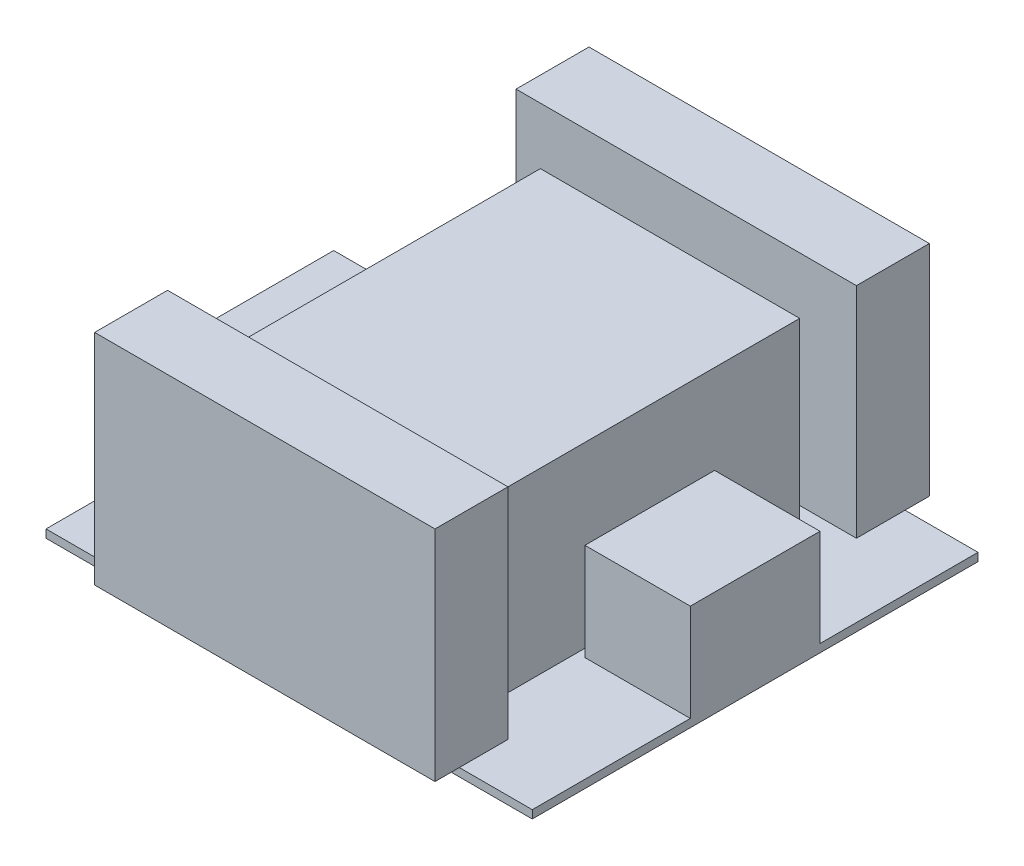
ISO-10303-21;
HEADER;
FILE_DESCRIPTION(('STEP AP214'),'2;1');
FILE_NAME('part.step','',(''),(''),'','','');
FILE_SCHEMA(('AUTOMOTIVE_DESIGN { 1 0 10303 214 1 1 1 1 }'));
ENDSEC;
DATA;
#1=APPLICATION_CONTEXT('core data for automotive mechanical design processes');
#2=APPLICATION_PROTOCOL_DEFINITION('international standard','automotive_design',2000,#1);
#3=PRODUCT_CONTEXT('',#1,'mechanical');
#4=PRODUCT('Part','Part','',(#3));
#5=PRODUCT_RELATED_PRODUCT_CATEGORY('part','',(#4));
#6=PRODUCT_DEFINITION_FORMATION('','',#4);
#7=PRODUCT_DEFINITION_CONTEXT('part definition',#1,'design');
#8=PRODUCT_DEFINITION('design','',#6,#7);
#9=PRODUCT_DEFINITION_SHAPE('','',#8);
#10=(LENGTH_UNIT() NAMED_UNIT(*) SI_UNIT(.MILLI.,.METRE.));
#11=(NAMED_UNIT(*) PLANE_ANGLE_UNIT() SI_UNIT($,.RADIAN.));
#12=(NAMED_UNIT(*) SI_UNIT($,.STERADIAN.) SOLID_ANGLE_UNIT());
#13=UNCERTAINTY_MEASURE_WITH_UNIT(LENGTH_MEASURE(1.E-05),#10,'distance_accuracy_value','');
#14=(GEOMETRIC_REPRESENTATION_CONTEXT(3) GLOBAL_UNCERTAINTY_ASSIGNED_CONTEXT((#13)) GLOBAL_UNIT_ASSIGNED_CONTEXT((#10,
#11,#12)) REPRESENTATION_CONTEXT('',''));
#15=CARTESIAN_POINT('',(0.,0.,0.));
#16=DIRECTION('',(0.,0.,1.));
#17=DIRECTION('',(1.,0.,0.));
#18=AXIS2_PLACEMENT_3D('',#15,#16,#17);
#19=CARTESIAN_POINT('',(0.,1.,0.));
#20=DIRECTION('',(0.,-1.,0.));
#21=DIRECTION('',(0.,0.,-1.));
#22=AXIS2_PLACEMENT_3D('',#19,#20,#21);
#23=PLANE('',#22);
#24=DIRECTION('',(-1.,0.,0.));
#25=VECTOR('',#24,1.);
#26=CARTESIAN_POINT('',(30.,1.,-8.));
#27=LINE('',#26,#25);
#28=CARTESIAN_POINT('',(30.,1.,-8.));
#29=VERTEX_POINT('',#28);
#30=CARTESIAN_POINT('',(17.,1.,-8.));
#31=VERTEX_POINT('',#30);
#32=EDGE_CURVE('E273',#29,#31,#27,.T.);
#33=ORIENTED_EDGE('',*,*,#32,.F.);
#34=DIRECTION('',(0.,0.,-1.));
#35=VECTOR('',#34,1.);
#36=CARTESIAN_POINT('',(30.,1.,27.5));
#37=LINE('',#36,#35);
#38=CARTESIAN_POINT('',(30.,1.,-27.5));
#39=VERTEX_POINT('',#38);
#40=EDGE_CURVE('E382',#29,#39,#37,.T.);
#41=ORIENTED_EDGE('',*,*,#40,.T.);
#42=DIRECTION('',(-1.,0.,0.));
#43=VECTOR('',#42,1.);
#44=CARTESIAN_POINT('',(-30.,1.,-27.5));
#45=LINE('',#44,#43);
#46=CARTESIAN_POINT('',(21.,1.,-27.5));
#47=VERTEX_POINT('',#46);
#48=EDGE_CURVE('E383',#39,#47,#45,.T.);
#49=ORIENTED_EDGE('',*,*,#48,.T.);
#50=DIRECTION('',(0.,0.,-1.));
#51=VECTOR('',#50,1.);
#52=CARTESIAN_POINT('',(21.,1.,-30.5));
#53=LINE('',#52,#51);
#54=CARTESIAN_POINT('',(21.,1.,-21.5));
#55=VERTEX_POINT('',#54);
#56=EDGE_CURVE('E363',#55,#47,#53,.T.);
#57=ORIENTED_EDGE('',*,*,#56,.F.);
#58=DIRECTION('',(1.,0.,0.));
#59=VECTOR('',#58,1.);
#60=CARTESIAN_POINT('',(-21.,1.,-21.5));
#61=LINE('',#60,#59);
#62=CARTESIAN_POINT('',(-21.,1.,-21.5));
#63=VERTEX_POINT('',#62);
#64=EDGE_CURVE('E359',#63,#55,#61,.T.);
#65=ORIENTED_EDGE('',*,*,#64,.F.);
#66=DIRECTION('',(0.,0.,1.));
#67=VECTOR('',#66,1.);
#68=CARTESIAN_POINT('',(-21.,1.,-30.5));
#69=LINE('',#68,#67);
#70=CARTESIAN_POINT('',(-21.,1.,-27.5));
#71=VERTEX_POINT('',#70);
#72=EDGE_CURVE('E12',#71,#63,#69,.T.);
#73=ORIENTED_EDGE('',*,*,#72,.F.);
#74=CARTESIAN_POINT('',(-30.,1.,-27.5));
#75=VERTEX_POINT('',#74);
#76=EDGE_CURVE('E381',#71,#75,#45,.T.);
#77=ORIENTED_EDGE('',*,*,#76,.T.);
#78=DIRECTION('',(0.,0.,1.));
#79=VECTOR('',#78,1.);
#80=CARTESIAN_POINT('',(-30.,1.,27.5));
#81=LINE('',#80,#79);
#82=CARTESIAN_POINT('',(-30.,1.,-8.));
#83=VERTEX_POINT('',#82);
#84=EDGE_CURVE('E388',#75,#83,#81,.T.);
#85=ORIENTED_EDGE('',*,*,#84,.T.);
#86=DIRECTION('',(-1.,0.,0.));
#87=VECTOR('',#86,1.);
#88=CARTESIAN_POINT('',(-30.,1.,-8.));
#89=LINE('',#88,#87);
#90=CARTESIAN_POINT('',(-17.,1.,-8.));
#91=VERTEX_POINT('',#90);
#92=EDGE_CURVE('E288',#91,#83,#89,.T.);
#93=ORIENTED_EDGE('',*,*,#92,.F.);
#94=DIRECTION('',(0.,0.,-1.));
#95=VECTOR('',#94,1.);
#96=CARTESIAN_POINT('',(-17.,1.,-8.));
#97=LINE('',#96,#95);
#98=CARTESIAN_POINT('',(-17.,1.,8.));
#99=VERTEX_POINT('',#98);
#100=EDGE_CURVE('E297',#99,#91,#97,.T.);
#101=ORIENTED_EDGE('',*,*,#100,.F.);
#102=DIRECTION('',(1.,0.,0.));
#103=VECTOR('',#102,1.);
#104=CARTESIAN_POINT('',(-30.,1.,8.));
#105=LINE('',#104,#103);
#106=CARTESIAN_POINT('',(-30.,1.,8.));
#107=VERTEX_POINT('',#106);
#108=EDGE_CURVE('E276',#107,#99,#105,.T.);
#109=ORIENTED_EDGE('',*,*,#108,.F.);
#110=CARTESIAN_POINT('',(-30.,1.,27.5));
#111=VERTEX_POINT('',#110);
#112=EDGE_CURVE('E386',#107,#111,#81,.T.);
#113=ORIENTED_EDGE('',*,*,#112,.T.);
#114=DIRECTION('',(1.,0.,0.));
#115=VECTOR('',#114,1.);
#116=CARTESIAN_POINT('',(-30.,1.,27.5));
#117=LINE('',#116,#115);
#118=CARTESIAN_POINT('',(-21.,1.,27.5));
#119=VERTEX_POINT('',#118);
#120=EDGE_CURVE('E391',#111,#119,#117,.T.);
#121=ORIENTED_EDGE('',*,*,#120,.T.);
#122=DIRECTION('',(0.,0.,1.));
#123=VECTOR('',#122,1.);
#124=CARTESIAN_POINT('',(-21.,1.,30.5));
#125=LINE('',#124,#123);
#126=CARTESIAN_POINT('',(-21.,1.,21.5));
#127=VERTEX_POINT('',#126);
#128=EDGE_CURVE('E337',#127,#119,#125,.T.);
#129=ORIENTED_EDGE('',*,*,#128,.F.);
#130=DIRECTION('',(-1.,0.,0.));
#131=VECTOR('',#130,1.);
#132=CARTESIAN_POINT('',(-21.,1.,21.5));
#133=LINE('',#132,#131);
#134=CARTESIAN_POINT('',(21.,1.,21.5));
#135=VERTEX_POINT('',#134);
#136=EDGE_CURVE('E326',#135,#127,#133,.T.);
#137=ORIENTED_EDGE('',*,*,#136,.F.);
#138=DIRECTION('',(0.,0.,-1.));
#139=VECTOR('',#138,1.);
#140=CARTESIAN_POINT('',(21.,1.,30.5));
#141=LINE('',#140,#139);
#142=CARTESIAN_POINT('',(21.,1.,27.5));
#143=VERTEX_POINT('',#142);
#144=EDGE_CURVE('E329',#143,#135,#141,.T.);
#145=ORIENTED_EDGE('',*,*,#144,.F.);
#146=CARTESIAN_POINT('',(30.,1.,27.5));
#147=VERTEX_POINT('',#146);
#148=EDGE_CURVE('E390',#143,#147,#117,.T.);
#149=ORIENTED_EDGE('',*,*,#148,.T.);
#150=CARTESIAN_POINT('',(30.,1.,8.));
#151=VERTEX_POINT('',#150);
#152=EDGE_CURVE('E379',#147,#151,#37,.T.);
#153=ORIENTED_EDGE('',*,*,#152,.T.);
#154=DIRECTION('',(1.,0.,0.));
#155=VECTOR('',#154,1.);
#156=CARTESIAN_POINT('',(30.,1.,8.));
#157=LINE('',#156,#155);
#158=CARTESIAN_POINT('',(17.,1.,8.));
#159=VERTEX_POINT('',#158);
#160=EDGE_CURVE('E266',#159,#151,#157,.T.);
#161=ORIENTED_EDGE('',*,*,#160,.F.);
#162=DIRECTION('',(0.,0.,1.));
#163=VECTOR('',#162,1.);
#164=CARTESIAN_POINT('',(17.,1.,-8.));
#165=LINE('',#164,#163);
#166=EDGE_CURVE('E269',#31,#159,#165,.T.);
#167=ORIENTED_EDGE('',*,*,#166,.F.);
#168=EDGE_LOOP('',(#33,#41,#49,#57,#65,#73,#77,#85,#93,#101,#109,#113,#121,#129,#137,#145,#149,
#153,#161,#167));
#169=FACE_BOUND('',#168,.T.);
#170=DIRECTION('',(0.,0.,-1.));
#171=VECTOR('',#170,1.);
#172=CARTESIAN_POINT('',(16.,1.,19.5));
#173=LINE('',#172,#171);
#174=CARTESIAN_POINT('',(16.,1.,19.5));
#175=VERTEX_POINT('',#174);
#176=CARTESIAN_POINT('',(16.,1.,-19.5));
#177=VERTEX_POINT('',#176);
#178=EDGE_CURVE('E248',#175,#177,#173,.T.);
#179=ORIENTED_EDGE('',*,*,#178,.F.);
#180=DIRECTION('',(1.,0.,0.));
#181=VECTOR('',#180,1.);
#182=CARTESIAN_POINT('',(-16.,1.,19.5));
#183=LINE('',#182,#181);
#184=CARTESIAN_POINT('',(-16.,1.,19.5));
#185=VERTEX_POINT('',#184);
#186=EDGE_CURVE('E226',#185,#175,#183,.T.);
#187=ORIENTED_EDGE('',*,*,#186,.F.);
#188=DIRECTION('',(0.,0.,1.));
#189=VECTOR('',#188,1.);
#190=CARTESIAN_POINT('',(-16.,1.,19.5));
#191=LINE('',#190,#189);
#192=CARTESIAN_POINT('',(-16.,1.,-19.5));
#193=VERTEX_POINT('',#192);
#194=EDGE_CURVE('E67',#193,#185,#191,.T.);
#195=ORIENTED_EDGE('',*,*,#194,.F.);
#196=DIRECTION('',(-1.,0.,0.));
#197=VECTOR('',#196,1.);
#198=CARTESIAN_POINT('',(-16.,1.,-19.5));
#199=LINE('',#198,#197);
#200=EDGE_CURVE('E62',#177,#193,#199,.T.);
#201=ORIENTED_EDGE('',*,*,#200,.F.);
#202=EDGE_LOOP('',(#179,#187,#195,#201));
#203=FACE_BOUND('',#202,.T.);
#204=ADVANCED_FACE('F45',(#169,#203),#23,.F.);
#205=CARTESIAN_POINT('',(30.,1.,27.5));
#206=DIRECTION('',(-1.,0.,0.));
#207=DIRECTION('',(0.,0.,1.));
#208=AXIS2_PLACEMENT_3D('',#205,#206,#207);
#209=PLANE('',#208);
#210=DIRECTION('',(0.,0.,-1.));
#211=VECTOR('',#210,1.);
#212=CARTESIAN_POINT('',(30.,0.,27.5));
#213=LINE('',#212,#211);
#214=CARTESIAN_POINT('',(30.,0.,27.5));
#215=VERTEX_POINT('',#214);
#216=CARTESIAN_POINT('',(30.,0.,-27.5));
#217=VERTEX_POINT('',#216);
#218=EDGE_CURVE('E378',#215,#217,#213,.T.);
#219=ORIENTED_EDGE('',*,*,#218,.T.);
#220=DIRECTION('',(0.,-1.,0.));
#221=VECTOR('',#220,1.);
#222=CARTESIAN_POINT('',(30.,1.,-27.5));
#223=LINE('',#222,#221);
#224=EDGE_CURVE('E49',#39,#217,#223,.T.);
#225=ORIENTED_EDGE('',*,*,#224,.F.);
#226=ORIENTED_EDGE('',*,*,#40,.F.);
#227=DIRECTION('',(0.,-1.,0.));
#228=VECTOR('',#227,1.);
#229=CARTESIAN_POINT('',(30.,13.,-8.));
#230=LINE('',#229,#228);
#231=CARTESIAN_POINT('',(30.,13.,-8.));
#232=VERTEX_POINT('',#231);
#233=EDGE_CURVE('E241',#232,#29,#230,.T.);
#234=ORIENTED_EDGE('',*,*,#233,.F.);
#235=DIRECTION('',(0.,0.,-1.));
#236=VECTOR('',#235,1.);
#237=CARTESIAN_POINT('',(30.,13.,-8.));
#238=LINE('',#237,#236);
#239=CARTESIAN_POINT('',(30.,13.,8.));
#240=VERTEX_POINT('',#239);
#241=EDGE_CURVE('E270',#240,#232,#238,.T.);
#242=ORIENTED_EDGE('',*,*,#241,.F.);
#243=DIRECTION('',(0.,-1.,0.));
#244=VECTOR('',#243,1.);
#245=CARTESIAN_POINT('',(30.,13.,8.));
#246=LINE('',#245,#244);
#247=EDGE_CURVE('E262',#240,#151,#246,.T.);
#248=ORIENTED_EDGE('',*,*,#247,.T.);
#249=ORIENTED_EDGE('',*,*,#152,.F.);
#250=DIRECTION('',(0.,-1.,0.));
#251=VECTOR('',#250,1.);
#252=CARTESIAN_POINT('',(30.,1.,27.5));
#253=LINE('',#252,#251);
#254=EDGE_CURVE('E394',#147,#215,#253,.T.);
#255=ORIENTED_EDGE('',*,*,#254,.T.);
#256=EDGE_LOOP('',(#219,#225,#226,#234,#242,#248,#249,#255));
#257=FACE_BOUND('',#256,.T.);
#258=ADVANCED_FACE('F47',(#257),#209,.F.);
#259=CARTESIAN_POINT('',(-30.,1.,-27.5));
#260=DIRECTION('',(0.,0.,1.));
#261=DIRECTION('',(1.,0.,0.));
#262=AXIS2_PLACEMENT_3D('',#259,#260,#261);
#263=PLANE('',#262);
#264=DIRECTION('',(-1.,0.,0.));
#265=VECTOR('',#264,1.);
#266=CARTESIAN_POINT('',(-30.,0.,-27.5));
#267=LINE('',#266,#265);
#268=CARTESIAN_POINT('',(-30.,0.,-27.5));
#269=VERTEX_POINT('',#268);
#270=EDGE_CURVE('E398',#217,#269,#267,.T.);
#271=ORIENTED_EDGE('',*,*,#270,.T.);
#272=DIRECTION('',(0.,-1.,0.));
#273=VECTOR('',#272,1.);
#274=CARTESIAN_POINT('',(-30.,1.,-27.5));
#275=LINE('',#274,#273);
#276=EDGE_CURVE('E408',#75,#269,#275,.T.);
#277=ORIENTED_EDGE('',*,*,#276,.F.);
#278=ORIENTED_EDGE('',*,*,#76,.F.);
#279=EDGE_CURVE('E387',#47,#71,#45,.T.);
#280=ORIENTED_EDGE('',*,*,#279,.F.);
#281=ORIENTED_EDGE('',*,*,#48,.F.);
#282=ORIENTED_EDGE('',*,*,#224,.T.);
#283=EDGE_LOOP('',(#271,#277,#278,#280,#281,#282));
#284=FACE_BOUND('',#283,.T.);
#285=ADVANCED_FACE('F418',(#284),#263,.F.);
#286=CARTESIAN_POINT('',(-30.,1.,27.5));
#287=DIRECTION('',(1.,0.,0.));
#288=DIRECTION('',(0.,0.,-1.));
#289=AXIS2_PLACEMENT_3D('',#286,#287,#288);
#290=PLANE('',#289);
#291=DIRECTION('',(0.,0.,1.));
#292=VECTOR('',#291,1.);
#293=CARTESIAN_POINT('',(-30.,0.,27.5));
#294=LINE('',#293,#292);
#295=CARTESIAN_POINT('',(-30.,0.,27.5));
#296=VERTEX_POINT('',#295);
#297=EDGE_CURVE('E400',#269,#296,#294,.T.);
#298=ORIENTED_EDGE('',*,*,#297,.T.);
#299=DIRECTION('',(0.,-1.,0.));
#300=VECTOR('',#299,1.);
#301=CARTESIAN_POINT('',(-30.,1.,27.5));
#302=LINE('',#301,#300);
#303=EDGE_CURVE('E406',#111,#296,#302,.T.);
#304=ORIENTED_EDGE('',*,*,#303,.F.);
#305=ORIENTED_EDGE('',*,*,#112,.F.);
#306=DIRECTION('',(0.,-1.,0.));
#307=VECTOR('',#306,1.);
#308=CARTESIAN_POINT('',(-30.,13.,8.));
#309=LINE('',#308,#307);
#310=CARTESIAN_POINT('',(-30.,13.,8.));
#311=VERTEX_POINT('',#310);
#312=EDGE_CURVE('E310',#311,#107,#309,.T.);
#313=ORIENTED_EDGE('',*,*,#312,.F.);
#314=DIRECTION('',(0.,0.,1.));
#315=VECTOR('',#314,1.);
#316=CARTESIAN_POINT('',(-30.,13.,-8.));
#317=LINE('',#316,#315);
#318=CARTESIAN_POINT('',(-30.,13.,-8.));
#319=VERTEX_POINT('',#318);
#320=EDGE_CURVE('E284',#319,#311,#317,.T.);
#321=ORIENTED_EDGE('',*,*,#320,.F.);
#322=DIRECTION('',(0.,-1.,0.));
#323=VECTOR('',#322,1.);
#324=CARTESIAN_POINT('',(-30.,13.,-8.));
#325=LINE('',#324,#323);
#326=EDGE_CURVE('E294',#319,#83,#325,.T.);
#327=ORIENTED_EDGE('',*,*,#326,.T.);
#328=ORIENTED_EDGE('',*,*,#84,.F.);
#329=ORIENTED_EDGE('',*,*,#276,.T.);
#330=EDGE_LOOP('',(#298,#304,#305,#313,#321,#327,#328,#329));
#331=FACE_BOUND('',#330,.T.);
#332=ADVANCED_FACE('F427',(#331),#290,.F.);
#333=CARTESIAN_POINT('',(-30.,1.,27.5));
#334=DIRECTION('',(0.,0.,-1.));
#335=DIRECTION('',(-1.,0.,0.));
#336=AXIS2_PLACEMENT_3D('',#333,#334,#335);
#337=PLANE('',#336);
#338=DIRECTION('',(1.,0.,0.));
#339=VECTOR('',#338,1.);
#340=CARTESIAN_POINT('',(-30.,0.,27.5));
#341=LINE('',#340,#339);
#342=EDGE_CURVE('E402',#296,#215,#341,.T.);
#343=ORIENTED_EDGE('',*,*,#342,.T.);
#344=ORIENTED_EDGE('',*,*,#254,.F.);
#345=ORIENTED_EDGE('',*,*,#148,.F.);
#346=EDGE_CURVE('E395',#119,#143,#117,.T.);
#347=ORIENTED_EDGE('',*,*,#346,.F.);
#348=ORIENTED_EDGE('',*,*,#120,.F.);
#349=ORIENTED_EDGE('',*,*,#303,.T.);
#350=EDGE_LOOP('',(#343,#344,#345,#347,#348,#349));
#351=FACE_BOUND('',#350,.T.);
#352=ADVANCED_FACE('F430',(#351),#337,.F.);
#353=CARTESIAN_POINT('',(0.,0.,0.));
#354=DIRECTION('',(0.,-1.,0.));
#355=DIRECTION('',(0.,0.,-1.));
#356=AXIS2_PLACEMENT_3D('',#353,#354,#355);
#357=PLANE('',#356);
#358=ORIENTED_EDGE('',*,*,#218,.F.);
#359=ORIENTED_EDGE('',*,*,#342,.F.);
#360=ORIENTED_EDGE('',*,*,#297,.F.);
#361=ORIENTED_EDGE('',*,*,#270,.F.);
#362=EDGE_LOOP('',(#358,#359,#360,#361));
#363=FACE_BOUND('',#362,.T.);
#364=ADVANCED_FACE('F425',(#363),#357,.T.);
#365=CARTESIAN_POINT('',(0.,1.,0.));
#366=DIRECTION('',(0.,1.,0.));
#367=DIRECTION('',(0.,0.,1.));
#368=AXIS2_PLACEMENT_3D('',#365,#366,#367);
#369=PLANE('',#368);
#370=CARTESIAN_POINT('',(21.,1.,-30.5));
#371=VERTEX_POINT('',#370);
#372=EDGE_CURVE('E362',#47,#371,#53,.T.);
#373=ORIENTED_EDGE('',*,*,#372,.F.);
#374=ORIENTED_EDGE('',*,*,#279,.T.);
#375=CARTESIAN_POINT('',(-21.,1.,-30.5));
#376=VERTEX_POINT('',#375);
#377=EDGE_CURVE('E55',#376,#71,#69,.T.);
#378=ORIENTED_EDGE('',*,*,#377,.F.);
#379=DIRECTION('',(-1.,0.,0.));
#380=VECTOR('',#379,1.);
#381=CARTESIAN_POINT('',(-21.,1.,-30.5));
#382=LINE('',#381,#380);
#383=EDGE_CURVE('E351',#371,#376,#382,.T.);
#384=ORIENTED_EDGE('',*,*,#383,.F.);
#385=EDGE_LOOP('',(#373,#374,#378,#384));
#386=FACE_BOUND('',#385,.T.);
#387=ADVANCED_FACE('F483',(#386),#369,.F.);
#388=CARTESIAN_POINT('',(-21.,28.,-30.5));
#389=DIRECTION('',(1.,0.,0.));
#390=DIRECTION('',(0.,0.,-1.));
#391=AXIS2_PLACEMENT_3D('',#388,#389,#390);
#392=PLANE('',#391);
#393=ORIENTED_EDGE('',*,*,#377,.T.);
#394=ORIENTED_EDGE('',*,*,#72,.T.);
#395=DIRECTION('',(0.,-1.,0.));
#396=VECTOR('',#395,1.);
#397=CARTESIAN_POINT('',(-21.,28.,-21.5));
#398=LINE('',#397,#396);
#399=CARTESIAN_POINT('',(-21.,28.,-21.5));
#400=VERTEX_POINT('',#399);
#401=EDGE_CURVE('E375',#400,#63,#398,.T.);
#402=ORIENTED_EDGE('',*,*,#401,.F.);
#403=DIRECTION('',(0.,0.,1.));
#404=VECTOR('',#403,1.);
#405=CARTESIAN_POINT('',(-21.,28.,-30.5));
#406=LINE('',#405,#404);
#407=CARTESIAN_POINT('',(-21.,28.,-30.5));
#408=VERTEX_POINT('',#407);
#409=EDGE_CURVE('E347',#408,#400,#406,.T.);
#410=ORIENTED_EDGE('',*,*,#409,.F.);
#411=DIRECTION('',(0.,-1.,0.));
#412=VECTOR('',#411,1.);
#413=CARTESIAN_POINT('',(-21.,28.,-30.5));
#414=LINE('',#413,#412);
#415=EDGE_CURVE('E356',#408,#376,#414,.T.);
#416=ORIENTED_EDGE('',*,*,#415,.T.);
#417=EDGE_LOOP('',(#393,#394,#402,#410,#416));
#418=FACE_BOUND('',#417,.T.);
#419=ADVANCED_FACE('F479',(#418),#392,.F.);
#420=CARTESIAN_POINT('',(-21.,28.,-21.5));
#421=DIRECTION('',(0.,0.,-1.));
#422=DIRECTION('',(-1.,0.,0.));
#423=AXIS2_PLACEMENT_3D('',#420,#421,#422);
#424=PLANE('',#423);
#425=ORIENTED_EDGE('',*,*,#64,.T.);
#426=DIRECTION('',(0.,-1.,0.));
#427=VECTOR('',#426,1.);
#428=CARTESIAN_POINT('',(21.,28.,-21.5));
#429=LINE('',#428,#427);
#430=CARTESIAN_POINT('',(21.,28.,-21.5));
#431=VERTEX_POINT('',#430);
#432=EDGE_CURVE('E372',#431,#55,#429,.T.);
#433=ORIENTED_EDGE('',*,*,#432,.F.);
#434=DIRECTION('',(1.,0.,0.));
#435=VECTOR('',#434,1.);
#436=CARTESIAN_POINT('',(-21.,28.,-21.5));
#437=LINE('',#436,#435);
#438=EDGE_CURVE('E350',#400,#431,#437,.T.);
#439=ORIENTED_EDGE('',*,*,#438,.F.);
#440=ORIENTED_EDGE('',*,*,#401,.T.);
#441=EDGE_LOOP('',(#425,#433,#439,#440));
#442=FACE_BOUND('',#441,.T.);
#443=ADVANCED_FACE('F517',(#442),#424,.F.);
#444=CARTESIAN_POINT('',(21.,28.,-30.5));
#445=DIRECTION('',(-1.,0.,0.));
#446=DIRECTION('',(0.,0.,1.));
#447=AXIS2_PLACEMENT_3D('',#444,#445,#446);
#448=PLANE('',#447);
#449=ORIENTED_EDGE('',*,*,#56,.T.);
#450=ORIENTED_EDGE('',*,*,#372,.T.);
#451=DIRECTION('',(0.,-1.,0.));
#452=VECTOR('',#451,1.);
#453=CARTESIAN_POINT('',(21.,28.,-30.5));
#454=LINE('',#453,#452);
#455=CARTESIAN_POINT('',(21.,28.,-30.5));
#456=VERTEX_POINT('',#455);
#457=EDGE_CURVE('E369',#456,#371,#454,.T.);
#458=ORIENTED_EDGE('',*,*,#457,.F.);
#459=DIRECTION('',(0.,0.,-1.));
#460=VECTOR('',#459,1.);
#461=CARTESIAN_POINT('',(21.,28.,-30.5));
#462=LINE('',#461,#460);
#463=EDGE_CURVE('E353',#431,#456,#462,.T.);
#464=ORIENTED_EDGE('',*,*,#463,.F.);
#465=ORIENTED_EDGE('',*,*,#432,.T.);
#466=EDGE_LOOP('',(#449,#450,#458,#464,#465));
#467=FACE_BOUND('',#466,.T.);
#468=ADVANCED_FACE('F524',(#467),#448,.F.);
#469=CARTESIAN_POINT('',(-21.,28.,-30.5));
#470=DIRECTION('',(0.,0.,1.));
#471=DIRECTION('',(1.,0.,0.));
#472=AXIS2_PLACEMENT_3D('',#469,#470,#471);
#473=PLANE('',#472);
#474=ORIENTED_EDGE('',*,*,#383,.T.);
#475=ORIENTED_EDGE('',*,*,#415,.F.);
#476=DIRECTION('',(-1.,0.,0.));
#477=VECTOR('',#476,1.);
#478=CARTESIAN_POINT('',(-21.,28.,-30.5));
#479=LINE('',#478,#477);
#480=EDGE_CURVE('E355',#456,#408,#479,.T.);
#481=ORIENTED_EDGE('',*,*,#480,.F.);
#482=ORIENTED_EDGE('',*,*,#457,.T.);
#483=EDGE_LOOP('',(#474,#475,#481,#482));
#484=FACE_BOUND('',#483,.T.);
#485=ADVANCED_FACE('F531',(#484),#473,.F.);
#486=CARTESIAN_POINT('',(0.,28.,0.));
#487=DIRECTION('',(0.,1.,0.));
#488=DIRECTION('',(0.,0.,1.));
#489=AXIS2_PLACEMENT_3D('',#486,#487,#488);
#490=PLANE('',#489);
#491=ORIENTED_EDGE('',*,*,#409,.T.);
#492=ORIENTED_EDGE('',*,*,#438,.T.);
#493=ORIENTED_EDGE('',*,*,#463,.T.);
#494=ORIENTED_EDGE('',*,*,#480,.T.);
#495=EDGE_LOOP('',(#491,#492,#493,#494));
#496=FACE_BOUND('',#495,.T.);
#497=ADVANCED_FACE('F539',(#496),#490,.T.);
#498=CARTESIAN_POINT('',(0.,1.,0.));
#499=DIRECTION('',(0.,-1.,0.));
#500=DIRECTION('',(0.,0.,-1.));
#501=AXIS2_PLACEMENT_3D('',#498,#499,#500);
#502=PLANE('',#501);
#503=ORIENTED_EDGE('',*,*,#346,.T.);
#504=CARTESIAN_POINT('',(21.,1.,30.5));
#505=VERTEX_POINT('',#504);
#506=EDGE_CURVE('E331',#505,#143,#141,.T.);
#507=ORIENTED_EDGE('',*,*,#506,.F.);
#508=DIRECTION('',(1.,0.,0.));
#509=VECTOR('',#508,1.);
#510=CARTESIAN_POINT('',(-21.,1.,30.5));
#511=LINE('',#510,#509);
#512=CARTESIAN_POINT('',(-21.,1.,30.5));
#513=VERTEX_POINT('',#512);
#514=EDGE_CURVE('E334',#513,#505,#511,.T.);
#515=ORIENTED_EDGE('',*,*,#514,.F.);
#516=EDGE_CURVE('E336',#119,#513,#125,.T.);
#517=ORIENTED_EDGE('',*,*,#516,.F.);
#518=EDGE_LOOP('',(#503,#507,#515,#517));
#519=FACE_BOUND('',#518,.T.);
#520=ADVANCED_FACE('F438',(#519),#502,.T.);
#521=CARTESIAN_POINT('',(-21.,28.,30.5));
#522=DIRECTION('',(1.,0.,0.));
#523=DIRECTION('',(0.,0.,-1.));
#524=AXIS2_PLACEMENT_3D('',#521,#522,#523);
#525=PLANE('',#524);
#526=ORIENTED_EDGE('',*,*,#128,.T.);
#527=ORIENTED_EDGE('',*,*,#516,.T.);
#528=DIRECTION('',(0.,-1.,0.));
#529=VECTOR('',#528,1.);
#530=CARTESIAN_POINT('',(-21.,28.,30.5));
#531=LINE('',#530,#529);
#532=CARTESIAN_POINT('',(-21.,28.,30.5));
#533=VERTEX_POINT('',#532);
#534=EDGE_CURVE('E313',#533,#513,#531,.T.);
#535=ORIENTED_EDGE('',*,*,#534,.F.);
#536=DIRECTION('',(0.,0.,1.));
#537=VECTOR('',#536,1.);
#538=CARTESIAN_POINT('',(-21.,28.,30.5));
#539=LINE('',#538,#537);
#540=CARTESIAN_POINT('',(-21.,28.,21.5));
#541=VERTEX_POINT('',#540);
#542=EDGE_CURVE('E330',#541,#533,#539,.T.);
#543=ORIENTED_EDGE('',*,*,#542,.F.);
#544=DIRECTION('',(0.,-1.,0.));
#545=VECTOR('',#544,1.);
#546=CARTESIAN_POINT('',(-21.,28.,21.5));
#547=LINE('',#546,#545);
#548=EDGE_CURVE('E322',#541,#127,#547,.T.);
#549=ORIENTED_EDGE('',*,*,#548,.T.);
#550=EDGE_LOOP('',(#526,#527,#535,#543,#549));
#551=FACE_BOUND('',#550,.T.);
#552=ADVANCED_FACE('F442',(#551),#525,.F.);
#553=CARTESIAN_POINT('',(-21.,28.,30.5));
#554=DIRECTION('',(0.,0.,-1.));
#555=DIRECTION('',(-1.,0.,0.));
#556=AXIS2_PLACEMENT_3D('',#553,#554,#555);
#557=PLANE('',#556);
#558=ORIENTED_EDGE('',*,*,#514,.T.);
#559=DIRECTION('',(0.,-1.,0.));
#560=VECTOR('',#559,1.);
#561=CARTESIAN_POINT('',(21.,28.,30.5));
#562=LINE('',#561,#560);
#563=CARTESIAN_POINT('',(21.,28.,30.5));
#564=VERTEX_POINT('',#563);
#565=EDGE_CURVE('E316',#564,#505,#562,.T.);
#566=ORIENTED_EDGE('',*,*,#565,.F.);
#567=DIRECTION('',(1.,0.,0.));
#568=VECTOR('',#567,1.);
#569=CARTESIAN_POINT('',(-21.,28.,30.5));
#570=LINE('',#569,#568);
#571=EDGE_CURVE('E343',#533,#564,#570,.T.);
#572=ORIENTED_EDGE('',*,*,#571,.F.);
#573=ORIENTED_EDGE('',*,*,#534,.T.);
#574=EDGE_LOOP('',(#558,#566,#572,#573));
#575=FACE_BOUND('',#574,.T.);
#576=ADVANCED_FACE('F456',(#575),#557,.F.);
#577=CARTESIAN_POINT('',(21.,28.,30.5));
#578=DIRECTION('',(-1.,0.,0.));
#579=DIRECTION('',(0.,0.,1.));
#580=AXIS2_PLACEMENT_3D('',#577,#578,#579);
#581=PLANE('',#580);
#582=ORIENTED_EDGE('',*,*,#506,.T.);
#583=ORIENTED_EDGE('',*,*,#144,.T.);
#584=DIRECTION('',(0.,-1.,0.));
#585=VECTOR('',#584,1.);
#586=CARTESIAN_POINT('',(21.,28.,21.5));
#587=LINE('',#586,#585);
#588=CARTESIAN_POINT('',(21.,28.,21.5));
#589=VERTEX_POINT('',#588);
#590=EDGE_CURVE('E319',#589,#135,#587,.T.);
#591=ORIENTED_EDGE('',*,*,#590,.F.);
#592=DIRECTION('',(0.,0.,-1.));
#593=VECTOR('',#592,1.);
#594=CARTESIAN_POINT('',(21.,28.,30.5));
#595=LINE('',#594,#593);
#596=EDGE_CURVE('E341',#564,#589,#595,.T.);
#597=ORIENTED_EDGE('',*,*,#596,.F.);
#598=ORIENTED_EDGE('',*,*,#565,.T.);
#599=EDGE_LOOP('',(#582,#583,#591,#597,#598));
#600=FACE_BOUND('',#599,.T.);
#601=ADVANCED_FACE('F452',(#600),#581,.F.);
#602=CARTESIAN_POINT('',(-21.,28.,21.5));
#603=DIRECTION('',(0.,0.,1.));
#604=DIRECTION('',(1.,0.,0.));
#605=AXIS2_PLACEMENT_3D('',#602,#603,#604);
#606=PLANE('',#605);
#607=ORIENTED_EDGE('',*,*,#136,.T.);
#608=ORIENTED_EDGE('',*,*,#548,.F.);
#609=DIRECTION('',(-1.,0.,0.));
#610=VECTOR('',#609,1.);
#611=CARTESIAN_POINT('',(-21.,28.,21.5));
#612=LINE('',#611,#610);
#613=EDGE_CURVE('E325',#589,#541,#612,.T.);
#614=ORIENTED_EDGE('',*,*,#613,.F.);
#615=ORIENTED_EDGE('',*,*,#590,.T.);
#616=EDGE_LOOP('',(#607,#608,#614,#615));
#617=FACE_BOUND('',#616,.T.);
#618=ADVANCED_FACE('F447',(#617),#606,.F.);
#619=CARTESIAN_POINT('',(0.,28.,0.));
#620=DIRECTION('',(0.,-1.,0.));
#621=DIRECTION('',(0.,0.,-1.));
#622=AXIS2_PLACEMENT_3D('',#619,#620,#621);
#623=PLANE('',#622);
#624=ORIENTED_EDGE('',*,*,#542,.T.);
#625=ORIENTED_EDGE('',*,*,#571,.T.);
#626=ORIENTED_EDGE('',*,*,#596,.T.);
#627=ORIENTED_EDGE('',*,*,#613,.T.);
#628=EDGE_LOOP('',(#624,#625,#626,#627));
#629=FACE_BOUND('',#628,.T.);
#630=ADVANCED_FACE('F458',(#629),#623,.F.);
#631=CARTESIAN_POINT('',(-30.,13.,8.));
#632=DIRECTION('',(0.,0.,-1.));
#633=DIRECTION('',(-1.,0.,0.));
#634=AXIS2_PLACEMENT_3D('',#631,#632,#633);
#635=PLANE('',#634);
#636=ORIENTED_EDGE('',*,*,#108,.T.);
#637=DIRECTION('',(0.,-1.,0.));
#638=VECTOR('',#637,1.);
#639=CARTESIAN_POINT('',(-17.,13.,8.));
#640=LINE('',#639,#638);
#641=CARTESIAN_POINT('',(-17.,13.,8.));
#642=VERTEX_POINT('',#641);
#643=EDGE_CURVE('E307',#642,#99,#640,.T.);
#644=ORIENTED_EDGE('',*,*,#643,.F.);
#645=DIRECTION('',(1.,0.,0.));
#646=VECTOR('',#645,1.);
#647=CARTESIAN_POINT('',(-30.,13.,8.));
#648=LINE('',#647,#646);
#649=EDGE_CURVE('E287',#311,#642,#648,.T.);
#650=ORIENTED_EDGE('',*,*,#649,.F.);
#651=ORIENTED_EDGE('',*,*,#312,.T.);
#652=EDGE_LOOP('',(#636,#644,#650,#651));
#653=FACE_BOUND('',#652,.T.);
#654=ADVANCED_FACE('F460',(#653),#635,.F.);
#655=CARTESIAN_POINT('',(-17.,13.,-8.));
#656=DIRECTION('',(-1.,0.,0.));
#657=DIRECTION('',(0.,0.,1.));
#658=AXIS2_PLACEMENT_3D('',#655,#656,#657);
#659=PLANE('',#658);
#660=ORIENTED_EDGE('',*,*,#100,.T.);
#661=DIRECTION('',(0.,-1.,0.));
#662=VECTOR('',#661,1.);
#663=CARTESIAN_POINT('',(-17.,13.,-8.));
#664=LINE('',#663,#662);
#665=CARTESIAN_POINT('',(-17.,13.,-8.));
#666=VERTEX_POINT('',#665);
#667=EDGE_CURVE('E304',#666,#91,#664,.T.);
#668=ORIENTED_EDGE('',*,*,#667,.F.);
#669=DIRECTION('',(0.,0.,-1.));
#670=VECTOR('',#669,1.);
#671=CARTESIAN_POINT('',(-17.,13.,-8.));
#672=LINE('',#671,#670);
#673=EDGE_CURVE('E290',#642,#666,#672,.T.);
#674=ORIENTED_EDGE('',*,*,#673,.F.);
#675=ORIENTED_EDGE('',*,*,#643,.T.);
#676=EDGE_LOOP('',(#660,#668,#674,#675));
#677=FACE_BOUND('',#676,.T.);
#678=ADVANCED_FACE('F466',(#677),#659,.F.);
#679=CARTESIAN_POINT('',(-30.,13.,-8.));
#680=DIRECTION('',(0.,0.,1.));
#681=DIRECTION('',(1.,0.,0.));
#682=AXIS2_PLACEMENT_3D('',#679,#680,#681);
#683=PLANE('',#682);
#684=ORIENTED_EDGE('',*,*,#92,.T.);
#685=ORIENTED_EDGE('',*,*,#326,.F.);
#686=DIRECTION('',(-1.,0.,0.));
#687=VECTOR('',#686,1.);
#688=CARTESIAN_POINT('',(-30.,13.,-8.));
#689=LINE('',#688,#687);
#690=EDGE_CURVE('E292',#666,#319,#689,.T.);
#691=ORIENTED_EDGE('',*,*,#690,.F.);
#692=ORIENTED_EDGE('',*,*,#667,.T.);
#693=EDGE_LOOP('',(#684,#685,#691,#692));
#694=FACE_BOUND('',#693,.T.);
#695=ADVANCED_FACE('F594',(#694),#683,.F.);
#696=CARTESIAN_POINT('',(0.,13.,0.));
#697=DIRECTION('',(0.,1.,0.));
#698=DIRECTION('',(0.,0.,1.));
#699=AXIS2_PLACEMENT_3D('',#696,#697,#698);
#700=PLANE('',#699);
#701=ORIENTED_EDGE('',*,*,#320,.T.);
#702=ORIENTED_EDGE('',*,*,#649,.T.);
#703=ORIENTED_EDGE('',*,*,#673,.T.);
#704=ORIENTED_EDGE('',*,*,#690,.T.);
#705=EDGE_LOOP('',(#701,#702,#703,#704));
#706=FACE_BOUND('',#705,.T.);
#707=ADVANCED_FACE('F604',(#706),#700,.T.);
#708=CARTESIAN_POINT('',(30.,13.,-8.));
#709=DIRECTION('',(0.,0.,1.));
#710=DIRECTION('',(1.,0.,0.));
#711=AXIS2_PLACEMENT_3D('',#708,#709,#710);
#712=PLANE('',#711);
#713=ORIENTED_EDGE('',*,*,#32,.T.);
#714=DIRECTION('',(0.,-1.,0.));
#715=VECTOR('',#714,1.);
#716=CARTESIAN_POINT('',(17.,13.,-8.));
#717=LINE('',#716,#715);
#718=CARTESIAN_POINT('',(17.,13.,-8.));
#719=VERTEX_POINT('',#718);
#720=EDGE_CURVE('E244',#719,#31,#717,.T.);
#721=ORIENTED_EDGE('',*,*,#720,.F.);
#722=DIRECTION('',(-1.,0.,0.));
#723=VECTOR('',#722,1.);
#724=CARTESIAN_POINT('',(30.,13.,-8.));
#725=LINE('',#724,#723);
#726=EDGE_CURVE('E280',#232,#719,#725,.T.);
#727=ORIENTED_EDGE('',*,*,#726,.F.);
#728=ORIENTED_EDGE('',*,*,#233,.T.);
#729=EDGE_LOOP('',(#713,#721,#727,#728));
#730=FACE_BOUND('',#729,.T.);
#731=ADVANCED_FACE('F614',(#730),#712,.F.);
#732=CARTESIAN_POINT('',(17.,13.,-8.));
#733=DIRECTION('',(1.,0.,0.));
#734=DIRECTION('',(0.,0.,-1.));
#735=AXIS2_PLACEMENT_3D('',#732,#733,#734);
#736=PLANE('',#735);
#737=ORIENTED_EDGE('',*,*,#166,.T.);
#738=DIRECTION('',(0.,-1.,0.));
#739=VECTOR('',#738,1.);
#740=CARTESIAN_POINT('',(17.,13.,8.));
#741=LINE('',#740,#739);
#742=CARTESIAN_POINT('',(17.,13.,8.));
#743=VERTEX_POINT('',#742);
#744=EDGE_CURVE('E259',#743,#159,#741,.T.);
#745=ORIENTED_EDGE('',*,*,#744,.F.);
#746=DIRECTION('',(0.,0.,1.));
#747=VECTOR('',#746,1.);
#748=CARTESIAN_POINT('',(17.,13.,-8.));
#749=LINE('',#748,#747);
#750=EDGE_CURVE('E278',#719,#743,#749,.T.);
#751=ORIENTED_EDGE('',*,*,#750,.F.);
#752=ORIENTED_EDGE('',*,*,#720,.T.);
#753=EDGE_LOOP('',(#737,#745,#751,#752));
#754=FACE_BOUND('',#753,.T.);
#755=ADVANCED_FACE('F624',(#754),#736,.F.);
#756=CARTESIAN_POINT('',(30.,13.,8.));
#757=DIRECTION('',(0.,0.,-1.));
#758=DIRECTION('',(-1.,0.,0.));
#759=AXIS2_PLACEMENT_3D('',#756,#757,#758);
#760=PLANE('',#759);
#761=ORIENTED_EDGE('',*,*,#160,.T.);
#762=ORIENTED_EDGE('',*,*,#247,.F.);
#763=DIRECTION('',(1.,0.,0.));
#764=VECTOR('',#763,1.);
#765=CARTESIAN_POINT('',(30.,13.,8.));
#766=LINE('',#765,#764);
#767=EDGE_CURVE('E265',#743,#240,#766,.T.);
#768=ORIENTED_EDGE('',*,*,#767,.F.);
#769=ORIENTED_EDGE('',*,*,#744,.T.);
#770=EDGE_LOOP('',(#761,#762,#768,#769));
#771=FACE_BOUND('',#770,.T.);
#772=ADVANCED_FACE('F634',(#771),#760,.F.);
#773=CARTESIAN_POINT('',(0.,13.,0.));
#774=DIRECTION('',(0.,-1.,0.));
#775=DIRECTION('',(0.,0.,-1.));
#776=AXIS2_PLACEMENT_3D('',#773,#774,#775);
#777=PLANE('',#776);
#778=ORIENTED_EDGE('',*,*,#241,.T.);
#779=ORIENTED_EDGE('',*,*,#726,.T.);
#780=ORIENTED_EDGE('',*,*,#750,.T.);
#781=ORIENTED_EDGE('',*,*,#767,.T.);
#782=EDGE_LOOP('',(#778,#779,#780,#781));
#783=FACE_BOUND('',#782,.T.);
#784=ADVANCED_FACE('F644',(#783),#777,.F.);
#785=CARTESIAN_POINT('',(16.,78.4479930225178,19.5));
#786=DIRECTION('',(-1.,0.,0.));
#787=DIRECTION('',(0.,0.,1.));
#788=AXIS2_PLACEMENT_3D('',#785,#786,#787);
#789=PLANE('',#788);
#790=DIRECTION('',(0.,0.,-1.));
#791=VECTOR('',#790,1.);
#792=CARTESIAN_POINT('',(16.,23.,19.5));
#793=LINE('',#792,#791);
#794=CARTESIAN_POINT('',(16.,23.,19.5));
#795=VERTEX_POINT('',#794);
#796=CARTESIAN_POINT('',(16.,23.,-19.5));
#797=VERTEX_POINT('',#796);
#798=EDGE_CURVE('E236',#795,#797,#793,.T.);
#799=ORIENTED_EDGE('',*,*,#798,.F.);
#800=DIRECTION('',(0.,-1.,0.));
#801=VECTOR('',#800,1.);
#802=CARTESIAN_POINT('',(16.,78.4479930225178,19.5));
#803=LINE('',#802,#801);
#804=EDGE_CURVE('E232',#795,#175,#803,.T.);
#805=ORIENTED_EDGE('',*,*,#804,.T.);
#806=ORIENTED_EDGE('',*,*,#178,.T.);
#807=DIRECTION('',(0.,-1.,0.));
#808=VECTOR('',#807,1.);
#809=CARTESIAN_POINT('',(16.,78.4479930225178,-19.5));
#810=LINE('',#809,#808);
#811=EDGE_CURVE('E252',#797,#177,#810,.T.);
#812=ORIENTED_EDGE('',*,*,#811,.F.);
#813=EDGE_LOOP('',(#799,#805,#806,#812));
#814=FACE_BOUND('',#813,.T.);
#815=ADVANCED_FACE('F653',(#814),#789,.F.);
#816=CARTESIAN_POINT('',(-16.,78.4479930225178,-19.5));
#817=DIRECTION('',(0.,0.,1.));
#818=DIRECTION('',(1.,0.,0.));
#819=AXIS2_PLACEMENT_3D('',#816,#817,#818);
#820=PLANE('',#819);
#821=DIRECTION('',(-1.,0.,0.));
#822=VECTOR('',#821,1.);
#823=CARTESIAN_POINT('',(-16.,23.,-19.5));
#824=LINE('',#823,#822);
#825=CARTESIAN_POINT('',(-16.,23.,-19.5));
#826=VERTEX_POINT('',#825);
#827=EDGE_CURVE('E240',#797,#826,#824,.T.);
#828=ORIENTED_EDGE('',*,*,#827,.F.);
#829=ORIENTED_EDGE('',*,*,#811,.T.);
#830=ORIENTED_EDGE('',*,*,#200,.T.);
#831=DIRECTION('',(0.,-1.,0.));
#832=VECTOR('',#831,1.);
#833=CARTESIAN_POINT('',(-16.,78.4479930225178,-19.5));
#834=LINE('',#833,#832);
#835=EDGE_CURVE('E254',#826,#193,#834,.T.);
#836=ORIENTED_EDGE('',*,*,#835,.F.);
#837=EDGE_LOOP('',(#828,#829,#830,#836));
#838=FACE_BOUND('',#837,.T.);
#839=ADVANCED_FACE('F673',(#838),#820,.F.);
#840=CARTESIAN_POINT('',(-16.,78.4479930225178,19.5));
#841=DIRECTION('',(1.,0.,0.));
#842=DIRECTION('',(0.,0.,-1.));
#843=AXIS2_PLACEMENT_3D('',#840,#841,#842);
#844=PLANE('',#843);
#845=DIRECTION('',(0.,0.,1.));
#846=VECTOR('',#845,1.);
#847=CARTESIAN_POINT('',(-16.,23.,19.5));
#848=LINE('',#847,#846);
#849=CARTESIAN_POINT('',(-16.,23.,19.5));
#850=VERTEX_POINT('',#849);
#851=EDGE_CURVE('E222',#826,#850,#848,.T.);
#852=ORIENTED_EDGE('',*,*,#851,.F.);
#853=ORIENTED_EDGE('',*,*,#835,.T.);
#854=ORIENTED_EDGE('',*,*,#194,.T.);
#855=DIRECTION('',(0.,-1.,0.));
#856=VECTOR('',#855,1.);
#857=CARTESIAN_POINT('',(-16.,78.4479930225178,19.5));
#858=LINE('',#857,#856);
#859=EDGE_CURVE('E218',#850,#185,#858,.T.);
#860=ORIENTED_EDGE('',*,*,#859,.F.);
#861=EDGE_LOOP('',(#852,#853,#854,#860));
#862=FACE_BOUND('',#861,.T.);
#863=ADVANCED_FACE('F220',(#862),#844,.F.);
#864=CARTESIAN_POINT('',(-16.,78.4479930225178,19.5));
#865=DIRECTION('',(0.,0.,-1.));
#866=DIRECTION('',(-1.,0.,0.));
#867=AXIS2_PLACEMENT_3D('',#864,#865,#866);
#868=PLANE('',#867);
#869=DIRECTION('',(1.,0.,0.));
#870=VECTOR('',#869,1.);
#871=CARTESIAN_POINT('',(-16.,23.,19.5));
#872=LINE('',#871,#870);
#873=EDGE_CURVE('E229',#850,#795,#872,.T.);
#874=ORIENTED_EDGE('',*,*,#873,.F.);
#875=ORIENTED_EDGE('',*,*,#859,.T.);
#876=ORIENTED_EDGE('',*,*,#186,.T.);
#877=ORIENTED_EDGE('',*,*,#804,.F.);
#878=EDGE_LOOP('',(#874,#875,#876,#877));
#879=FACE_BOUND('',#878,.T.);
#880=ADVANCED_FACE('F230',(#879),#868,.F.);
#881=CARTESIAN_POINT('',(0.,23.,0.));
#882=DIRECTION('',(0.,1.,0.));
#883=DIRECTION('',(0.,0.,1.));
#884=AXIS2_PLACEMENT_3D('',#881,#882,#883);
#885=PLANE('',#884);
#886=ORIENTED_EDGE('',*,*,#873,.T.);
#887=ORIENTED_EDGE('',*,*,#798,.T.);
#888=ORIENTED_EDGE('',*,*,#827,.T.);
#889=ORIENTED_EDGE('',*,*,#851,.T.);
#890=EDGE_LOOP('',(#886,#887,#888,#889));
#891=FACE_BOUND('',#890,.T.);
#892=ADVANCED_FACE('F239',(#891),#885,.T.);
#893=CLOSED_SHELL('',(#204,#258,#285,#332,#352,#364,#387,#419,#443,#468,#485,#497,#520,#552,
#576,#601,#618,#630,#654,#678,#695,#707,#731,#755,#772,#784,#815,#839,#863,#880,#892));
#894=MANIFOLD_SOLID_BREP('B2',#893);
#895=ADVANCED_BREP_SHAPE_REPRESENTATION('',(#18,#894),#14);
#896=SHAPE_DEFINITION_REPRESENTATION(#9,#895);
ENDSEC;
END-ISO-10303-21;
